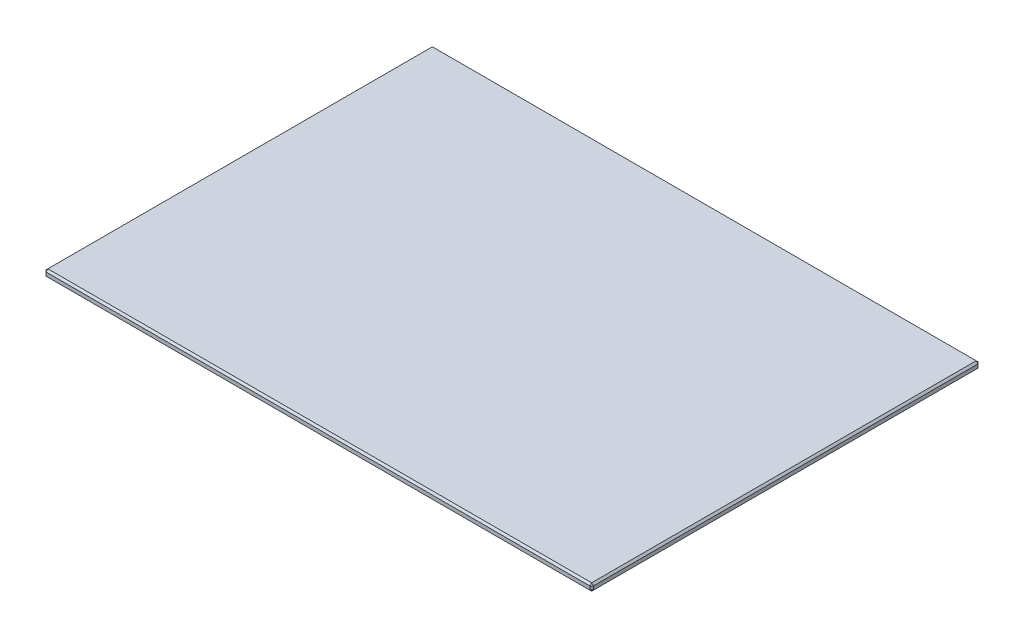
ISO-10303-21;
HEADER;
FILE_DESCRIPTION(('STEP AP214'),'2;1');
FILE_NAME('part.step','',(''),(''),'','','');
FILE_SCHEMA(('AUTOMOTIVE_DESIGN { 1 0 10303 214 1 1 1 1 }'));
ENDSEC;
DATA;
#1=APPLICATION_CONTEXT('core data for automotive mechanical design processes');
#2=APPLICATION_PROTOCOL_DEFINITION('international standard','automotive_design',2000,#1);
#3=PRODUCT_CONTEXT('',#1,'mechanical');
#4=PRODUCT('Part','Part','',(#3));
#5=PRODUCT_RELATED_PRODUCT_CATEGORY('part','',(#4));
#6=PRODUCT_DEFINITION_FORMATION('','',#4);
#7=PRODUCT_DEFINITION_CONTEXT('part definition',#1,'design');
#8=PRODUCT_DEFINITION('design','',#6,#7);
#9=PRODUCT_DEFINITION_SHAPE('','',#8);
#10=(LENGTH_UNIT() NAMED_UNIT(*) SI_UNIT(.MILLI.,.METRE.));
#11=(NAMED_UNIT(*) PLANE_ANGLE_UNIT() SI_UNIT($,.RADIAN.));
#12=(NAMED_UNIT(*) SI_UNIT($,.STERADIAN.) SOLID_ANGLE_UNIT());
#13=UNCERTAINTY_MEASURE_WITH_UNIT(LENGTH_MEASURE(1.E-05),#10,'distance_accuracy_value','');
#14=(GEOMETRIC_REPRESENTATION_CONTEXT(3) GLOBAL_UNCERTAINTY_ASSIGNED_CONTEXT((#13)) GLOBAL_UNIT_ASSIGNED_CONTEXT((#10,
#11,#12)) REPRESENTATION_CONTEXT('',''));
#15=CARTESIAN_POINT('',(0.,0.,0.));
#16=DIRECTION('',(0.,0.,1.));
#17=DIRECTION('',(1.,0.,0.));
#18=AXIS2_PLACEMENT_3D('',#15,#16,#17);
#19=CARTESIAN_POINT('',(-149.5,4.,106.));
#20=DIRECTION('',(1.,0.,0.));
#21=DIRECTION('',(0.,0.,-1.));
#22=AXIS2_PLACEMENT_3D('',#19,#20,#21);
#23=PLANE('',#22);
#24=DIRECTION('',(0.,-1.,0.));
#25=VECTOR('',#24,1.);
#26=CARTESIAN_POINT('',(-149.5,4.,-105.));
#27=LINE('',#26,#25);
#28=CARTESIAN_POINT('',(-149.5,3.,-105.));
#29=VERTEX_POINT('',#28);
#30=CARTESIAN_POINT('',(-149.5,1.,-105.));
#31=VERTEX_POINT('',#30);
#32=EDGE_CURVE('E194',#29,#31,#27,.T.);
#33=ORIENTED_EDGE('',*,*,#32,.T.);
#34=DIRECTION('',(0.,0.,1.));
#35=VECTOR('',#34,1.);
#36=CARTESIAN_POINT('',(-149.5,1.,106.));
#37=LINE('',#36,#35);
#38=CARTESIAN_POINT('',(-149.5,1.,105.));
#39=VERTEX_POINT('',#38);
#40=EDGE_CURVE('E196',#31,#39,#37,.T.);
#41=ORIENTED_EDGE('',*,*,#40,.T.);
#42=DIRECTION('',(0.,1.,0.));
#43=VECTOR('',#42,1.);
#44=CARTESIAN_POINT('',(-149.5,4.,105.));
#45=LINE('',#44,#43);
#46=CARTESIAN_POINT('',(-149.5,3.,105.));
#47=VERTEX_POINT('',#46);
#48=EDGE_CURVE('E190',#39,#47,#45,.T.);
#49=ORIENTED_EDGE('',*,*,#48,.T.);
#50=DIRECTION('',(0.,0.,-1.));
#51=VECTOR('',#50,1.);
#52=CARTESIAN_POINT('',(-149.5,3.,106.));
#53=LINE('',#52,#51);
#54=EDGE_CURVE('E192',#47,#29,#53,.T.);
#55=ORIENTED_EDGE('',*,*,#54,.T.);
#56=EDGE_LOOP('',(#33,#41,#49,#55));
#57=FACE_BOUND('',#56,.T.);
#58=ADVANCED_FACE('F35',(#57),#23,.F.);
#59=CARTESIAN_POINT('',(-149.5,4.,106.));
#60=DIRECTION('',(0.,0.,-1.));
#61=DIRECTION('',(-1.,0.,0.));
#62=AXIS2_PLACEMENT_3D('',#59,#60,#61);
#63=PLANE('',#62);
#64=DIRECTION('',(0.,-1.,0.));
#65=VECTOR('',#64,1.);
#66=CARTESIAN_POINT('',(-148.5,4.,106.));
#67=LINE('',#66,#65);
#68=CARTESIAN_POINT('',(-148.5,3.,106.));
#69=VERTEX_POINT('',#68);
#70=CARTESIAN_POINT('',(-148.5,1.,106.));
#71=VERTEX_POINT('',#70);
#72=EDGE_CURVE('E127',#69,#71,#67,.T.);
#73=ORIENTED_EDGE('',*,*,#72,.T.);
#74=DIRECTION('',(1.,0.,0.));
#75=VECTOR('',#74,1.);
#76=CARTESIAN_POINT('',(149.5,1.,106.));
#77=LINE('',#76,#75);
#78=CARTESIAN_POINT('',(148.5,1.,106.));
#79=VERTEX_POINT('',#78);
#80=EDGE_CURVE('E161',#71,#79,#77,.T.);
#81=ORIENTED_EDGE('',*,*,#80,.T.);
#82=DIRECTION('',(0.,1.,0.));
#83=VECTOR('',#82,1.);
#84=CARTESIAN_POINT('',(148.5,4.,106.));
#85=LINE('',#84,#83);
#86=CARTESIAN_POINT('',(148.5,3.,106.));
#87=VERTEX_POINT('',#86);
#88=EDGE_CURVE('E130',#79,#87,#85,.T.);
#89=ORIENTED_EDGE('',*,*,#88,.T.);
#90=DIRECTION('',(-1.,0.,0.));
#91=VECTOR('',#90,1.);
#92=CARTESIAN_POINT('',(-149.5,3.,106.));
#93=LINE('',#92,#91);
#94=EDGE_CURVE('E122',#87,#69,#93,.T.);
#95=ORIENTED_EDGE('',*,*,#94,.T.);
#96=EDGE_LOOP('',(#73,#81,#89,#95));
#97=FACE_BOUND('',#96,.T.);
#98=ADVANCED_FACE('F124',(#97),#63,.F.);
#99=CARTESIAN_POINT('',(149.5,4.,106.));
#100=DIRECTION('',(-1.,0.,0.));
#101=DIRECTION('',(0.,0.,1.));
#102=AXIS2_PLACEMENT_3D('',#99,#100,#101);
#103=PLANE('',#102);
#104=DIRECTION('',(0.,-1.,0.));
#105=VECTOR('',#104,1.);
#106=CARTESIAN_POINT('',(149.5,4.,105.));
#107=LINE('',#106,#105);
#108=CARTESIAN_POINT('',(149.5,3.,105.));
#109=VERTEX_POINT('',#108);
#110=CARTESIAN_POINT('',(149.5,1.,105.));
#111=VERTEX_POINT('',#110);
#112=EDGE_CURVE('E172',#109,#111,#107,.T.);
#113=ORIENTED_EDGE('',*,*,#112,.T.);
#114=DIRECTION('',(0.,0.,-1.));
#115=VECTOR('',#114,1.);
#116=CARTESIAN_POINT('',(149.5,1.,-106.));
#117=LINE('',#116,#115);
#118=CARTESIAN_POINT('',(149.5,1.,-105.));
#119=VERTEX_POINT('',#118);
#120=EDGE_CURVE('E178',#111,#119,#117,.T.);
#121=ORIENTED_EDGE('',*,*,#120,.T.);
#122=DIRECTION('',(0.,1.,0.));
#123=VECTOR('',#122,1.);
#124=CARTESIAN_POINT('',(149.5,4.,-105.));
#125=LINE('',#124,#123);
#126=CARTESIAN_POINT('',(149.5,3.,-105.));
#127=VERTEX_POINT('',#126);
#128=EDGE_CURVE('E176',#119,#127,#125,.T.);
#129=ORIENTED_EDGE('',*,*,#128,.T.);
#130=DIRECTION('',(0.,0.,1.));
#131=VECTOR('',#130,1.);
#132=CARTESIAN_POINT('',(149.5,3.,106.));
#133=LINE('',#132,#131);
#134=EDGE_CURVE('E174',#127,#109,#133,.T.);
#135=ORIENTED_EDGE('',*,*,#134,.T.);
#136=EDGE_LOOP('',(#113,#121,#129,#135));
#137=FACE_BOUND('',#136,.T.);
#138=ADVANCED_FACE('F265',(#137),#103,.F.);
#139=CARTESIAN_POINT('',(-149.5,4.,-106.));
#140=DIRECTION('',(0.,0.,1.));
#141=DIRECTION('',(1.,0.,0.));
#142=AXIS2_PLACEMENT_3D('',#139,#140,#141);
#143=PLANE('',#142);
#144=DIRECTION('',(1.,0.,0.));
#145=VECTOR('',#144,1.);
#146=CARTESIAN_POINT('',(-149.5,3.,-106.));
#147=LINE('',#146,#145);
#148=CARTESIAN_POINT('',(-148.5,3.,-106.));
#149=VERTEX_POINT('',#148);
#150=CARTESIAN_POINT('',(148.5,3.,-106.));
#151=VERTEX_POINT('',#150);
#152=EDGE_CURVE('E183',#149,#151,#147,.T.);
#153=ORIENTED_EDGE('',*,*,#152,.T.);
#154=DIRECTION('',(0.,-1.,0.));
#155=VECTOR('',#154,1.);
#156=CARTESIAN_POINT('',(148.5,4.,-106.));
#157=LINE('',#156,#155);
#158=CARTESIAN_POINT('',(148.5,1.,-106.));
#159=VERTEX_POINT('',#158);
#160=EDGE_CURVE('E188',#151,#159,#157,.T.);
#161=ORIENTED_EDGE('',*,*,#160,.T.);
#162=DIRECTION('',(-1.,0.,0.));
#163=VECTOR('',#162,1.);
#164=CARTESIAN_POINT('',(-149.5,1.,-106.));
#165=LINE('',#164,#163);
#166=CARTESIAN_POINT('',(-148.5,1.,-106.));
#167=VERTEX_POINT('',#166);
#168=EDGE_CURVE('E185',#159,#167,#165,.T.);
#169=ORIENTED_EDGE('',*,*,#168,.T.);
#170=DIRECTION('',(0.,1.,0.));
#171=VECTOR('',#170,1.);
#172=CARTESIAN_POINT('',(-148.5,4.,-106.));
#173=LINE('',#172,#171);
#174=EDGE_CURVE('E181',#167,#149,#173,.T.);
#175=ORIENTED_EDGE('',*,*,#174,.T.);
#176=EDGE_LOOP('',(#153,#161,#169,#175));
#177=FACE_BOUND('',#176,.T.);
#178=ADVANCED_FACE('F274',(#177),#143,.F.);
#179=CARTESIAN_POINT('',(0.,4.,0.));
#180=DIRECTION('',(0.,-1.,0.));
#181=DIRECTION('',(0.,0.,-1.));
#182=AXIS2_PLACEMENT_3D('',#179,#180,#181);
#183=PLANE('',#182);
#184=DIRECTION('',(0.,0.,-1.));
#185=VECTOR('',#184,1.);
#186=CARTESIAN_POINT('',(148.5,4.,0.));
#187=LINE('',#186,#185);
#188=CARTESIAN_POINT('',(148.5,4.,105.));
#189=VERTEX_POINT('',#188);
#190=CARTESIAN_POINT('',(148.5,4.,-105.));
#191=VERTEX_POINT('',#190);
#192=EDGE_CURVE('E44',#189,#191,#187,.T.);
#193=ORIENTED_EDGE('',*,*,#192,.T.);
#194=DIRECTION('',(-1.,0.,0.));
#195=VECTOR('',#194,1.);
#196=CARTESIAN_POINT('',(0.,4.,-105.));
#197=LINE('',#196,#195);
#198=CARTESIAN_POINT('',(-148.5,4.,-105.));
#199=VERTEX_POINT('',#198);
#200=EDGE_CURVE('E11',#191,#199,#197,.T.);
#201=ORIENTED_EDGE('',*,*,#200,.T.);
#202=DIRECTION('',(0.,0.,1.));
#203=VECTOR('',#202,1.);
#204=CARTESIAN_POINT('',(-148.5,4.,0.));
#205=LINE('',#204,#203);
#206=CARTESIAN_POINT('',(-148.5,4.,105.));
#207=VERTEX_POINT('',#206);
#208=EDGE_CURVE('E199',#199,#207,#205,.T.);
#209=ORIENTED_EDGE('',*,*,#208,.T.);
#210=DIRECTION('',(1.,0.,0.));
#211=VECTOR('',#210,1.);
#212=CARTESIAN_POINT('',(0.,4.,105.));
#213=LINE('',#212,#211);
#214=EDGE_CURVE('E55',#207,#189,#213,.T.);
#215=ORIENTED_EDGE('',*,*,#214,.T.);
#216=EDGE_LOOP('',(#193,#201,#209,#215));
#217=FACE_BOUND('',#216,.T.);
#218=ADVANCED_FACE('F296',(#217),#183,.F.);
#219=CARTESIAN_POINT('',(0.,0.,0.));
#220=DIRECTION('',(0.,-1.,0.));
#221=DIRECTION('',(0.,0.,-1.));
#222=AXIS2_PLACEMENT_3D('',#219,#220,#221);
#223=PLANE('',#222);
#224=DIRECTION('',(0.,0.,1.));
#225=VECTOR('',#224,1.);
#226=CARTESIAN_POINT('',(148.5,0.,106.));
#227=LINE('',#226,#225);
#228=CARTESIAN_POINT('',(148.5,0.,-105.));
#229=VERTEX_POINT('',#228);
#230=CARTESIAN_POINT('',(148.5,0.,105.));
#231=VERTEX_POINT('',#230);
#232=EDGE_CURVE('E167',#229,#231,#227,.T.);
#233=ORIENTED_EDGE('',*,*,#232,.T.);
#234=DIRECTION('',(-1.,0.,0.));
#235=VECTOR('',#234,1.);
#236=CARTESIAN_POINT('',(-149.5,0.,105.));
#237=LINE('',#236,#235);
#238=CARTESIAN_POINT('',(-148.5,0.,105.));
#239=VERTEX_POINT('',#238);
#240=EDGE_CURVE('E169',#231,#239,#237,.T.);
#241=ORIENTED_EDGE('',*,*,#240,.T.);
#242=DIRECTION('',(0.,0.,-1.));
#243=VECTOR('',#242,1.);
#244=CARTESIAN_POINT('',(-148.5,0.,-106.));
#245=LINE('',#244,#243);
#246=CARTESIAN_POINT('',(-148.5,0.,-105.));
#247=VERTEX_POINT('',#246);
#248=EDGE_CURVE('E163',#239,#247,#245,.T.);
#249=ORIENTED_EDGE('',*,*,#248,.T.);
#250=DIRECTION('',(1.,0.,0.));
#251=VECTOR('',#250,1.);
#252=CARTESIAN_POINT('',(149.5,0.,-105.));
#253=LINE('',#252,#251);
#254=EDGE_CURVE('E165',#247,#229,#253,.T.);
#255=ORIENTED_EDGE('',*,*,#254,.T.);
#256=EDGE_LOOP('',(#233,#241,#249,#255));
#257=FACE_BOUND('',#256,.T.);
#258=ADVANCED_FACE('F298',(#257),#223,.T.);
#259=CARTESIAN_POINT('',(0.,4.,-105.));
#260=DIRECTION('',(0.,-0.707106781186547,0.707106781186547));
#261=DIRECTION('',(-1.,0.,0.));
#262=AXIS2_PLACEMENT_3D('',#259,#260,#261);
#263=PLANE('',#262);
#264=DIRECTION('',(0.,0.707106781186547,0.707106781186547));
#265=VECTOR('',#264,1.);
#266=CARTESIAN_POINT('',(-148.5,4.,-105.));
#267=LINE('',#266,#265);
#268=EDGE_CURVE('E39',#199,#149,#267,.F.);
#269=ORIENTED_EDGE('',*,*,#268,.F.);
#270=ORIENTED_EDGE('',*,*,#200,.F.);
#271=DIRECTION('',(0.,-0.707106781186547,-0.707106781186547));
#272=VECTOR('',#271,1.);
#273=CARTESIAN_POINT('',(148.5,3.,-106.));
#274=LINE('',#273,#272);
#275=EDGE_CURVE('E158',#151,#191,#274,.F.);
#276=ORIENTED_EDGE('',*,*,#275,.F.);
#277=ORIENTED_EDGE('',*,*,#152,.F.);
#278=EDGE_LOOP('',(#269,#270,#276,#277));
#279=FACE_BOUND('',#278,.T.);
#280=ADVANCED_FACE('F37',(#279),#263,.F.);
#281=CARTESIAN_POINT('',(-148.5,4.,-105.));
#282=DIRECTION('',(-0.577350269189626,0.577350269189626,-0.577350269189626));
#283=DIRECTION('',(-0.707106781186547,0.,0.707106781186547));
#284=AXIS2_PLACEMENT_3D('',#281,#282,#283);
#285=PLANE('',#284);
#286=DIRECTION('',(-0.707106781186547,-0.707106781186547,0.));
#287=VECTOR('',#286,1.);
#288=CARTESIAN_POINT('',(-148.5,4.,-105.));
#289=LINE('',#288,#287);
#290=EDGE_CURVE('E245',#199,#29,#289,.T.);
#291=ORIENTED_EDGE('',*,*,#290,.F.);
#292=ORIENTED_EDGE('',*,*,#268,.T.);
#293=DIRECTION('',(0.707106781186547,0.,-0.707106781186547));
#294=VECTOR('',#293,1.);
#295=CARTESIAN_POINT('',(-149.,3.,-105.5));
#296=LINE('',#295,#294);
#297=EDGE_CURVE('E248',#29,#149,#296,.T.);
#298=ORIENTED_EDGE('',*,*,#297,.F.);
#299=EDGE_LOOP('',(#291,#292,#298));
#300=FACE_BOUND('',#299,.T.);
#301=ADVANCED_FACE('F292',(#300),#285,.T.);
#302=CARTESIAN_POINT('',(148.5,3.,-106.));
#303=DIRECTION('',(0.577350269189626,0.577350269189626,-0.577350269189626));
#304=DIRECTION('',(-0.707106781186547,0.,-0.707106781186547));
#305=AXIS2_PLACEMENT_3D('',#302,#303,#304);
#306=PLANE('',#305);
#307=DIRECTION('',(0.707106781186547,0.,0.707106781186547));
#308=VECTOR('',#307,1.);
#309=CARTESIAN_POINT('',(148.5,3.,-106.));
#310=LINE('',#309,#308);
#311=EDGE_CURVE('E239',#151,#127,#310,.T.);
#312=ORIENTED_EDGE('',*,*,#311,.F.);
#313=ORIENTED_EDGE('',*,*,#275,.T.);
#314=DIRECTION('',(-0.707106781186547,0.707106781186547,0.));
#315=VECTOR('',#314,1.);
#316=CARTESIAN_POINT('',(149.,3.5,-105.));
#317=LINE('',#316,#315);
#318=EDGE_CURVE('E242',#127,#191,#317,.T.);
#319=ORIENTED_EDGE('',*,*,#318,.F.);
#320=EDGE_LOOP('',(#312,#313,#319));
#321=FACE_BOUND('',#320,.T.);
#322=ADVANCED_FACE('F255',(#321),#306,.T.);
#323=CARTESIAN_POINT('',(-149.5,4.,-105.));
#324=DIRECTION('',(0.707106781186547,0.,0.707106781186547));
#325=DIRECTION('',(0.,-1.,0.));
#326=AXIS2_PLACEMENT_3D('',#323,#324,#325);
#327=PLANE('',#326);
#328=ORIENTED_EDGE('',*,*,#297,.T.);
#329=ORIENTED_EDGE('',*,*,#174,.F.);
#330=DIRECTION('',(-0.707106781186547,0.,0.707106781186547));
#331=VECTOR('',#330,1.);
#332=CARTESIAN_POINT('',(-148.5,1.,-106.));
#333=LINE('',#332,#331);
#334=EDGE_CURVE('E234',#31,#167,#333,.F.);
#335=ORIENTED_EDGE('',*,*,#334,.F.);
#336=ORIENTED_EDGE('',*,*,#32,.F.);
#337=EDGE_LOOP('',(#328,#329,#335,#336));
#338=FACE_BOUND('',#337,.T.);
#339=ADVANCED_FACE('F286',(#338),#327,.F.);
#340=CARTESIAN_POINT('',(-148.5,4.,0.));
#341=DIRECTION('',(0.707106781186547,-0.707106781186547,0.));
#342=DIRECTION('',(0.,0.,1.));
#343=AXIS2_PLACEMENT_3D('',#340,#341,#342);
#344=PLANE('',#343);
#345=ORIENTED_EDGE('',*,*,#290,.T.);
#346=ORIENTED_EDGE('',*,*,#54,.F.);
#347=DIRECTION('',(0.707106781186547,0.707106781186547,0.));
#348=VECTOR('',#347,1.);
#349=CARTESIAN_POINT('',(-149.,3.5,105.));
#350=LINE('',#349,#348);
#351=EDGE_CURVE('E142',#207,#47,#350,.F.);
#352=ORIENTED_EDGE('',*,*,#351,.F.);
#353=ORIENTED_EDGE('',*,*,#208,.F.);
#354=EDGE_LOOP('',(#345,#346,#352,#353));
#355=FACE_BOUND('',#354,.T.);
#356=ADVANCED_FACE('F295',(#355),#344,.F.);
#357=CARTESIAN_POINT('',(0.,4.,105.));
#358=DIRECTION('',(0.,-0.707106781186547,-0.707106781186547));
#359=DIRECTION('',(1.,0.,0.));
#360=AXIS2_PLACEMENT_3D('',#357,#358,#359);
#361=PLANE('',#360);
#362=DIRECTION('',(0.,0.707106781186547,-0.707106781186547));
#363=VECTOR('',#362,1.);
#364=CARTESIAN_POINT('',(148.5,3.5,105.5));
#365=LINE('',#364,#363);
#366=EDGE_CURVE('E143',#189,#87,#365,.F.);
#367=ORIENTED_EDGE('',*,*,#366,.F.);
#368=ORIENTED_EDGE('',*,*,#214,.F.);
#369=DIRECTION('',(0.,-0.707106781186547,0.707106781186547));
#370=VECTOR('',#369,1.);
#371=CARTESIAN_POINT('',(-148.5,3.,106.));
#372=LINE('',#371,#370);
#373=EDGE_CURVE('E136',#69,#207,#372,.F.);
#374=ORIENTED_EDGE('',*,*,#373,.F.);
#375=ORIENTED_EDGE('',*,*,#94,.F.);
#376=EDGE_LOOP('',(#367,#368,#374,#375));
#377=FACE_BOUND('',#376,.T.);
#378=ADVANCED_FACE('F138',(#377),#361,.F.);
#379=CARTESIAN_POINT('',(148.5,4.,0.));
#380=DIRECTION('',(-0.707106781186547,-0.707106781186547,0.));
#381=DIRECTION('',(0.,0.,-1.));
#382=AXIS2_PLACEMENT_3D('',#379,#380,#381);
#383=PLANE('',#382);
#384=ORIENTED_EDGE('',*,*,#318,.T.);
#385=ORIENTED_EDGE('',*,*,#192,.F.);
#386=DIRECTION('',(0.707106781186547,-0.707106781186547,0.));
#387=VECTOR('',#386,1.);
#388=CARTESIAN_POINT('',(149.5,3.,105.));
#389=LINE('',#388,#387);
#390=EDGE_CURVE('E229',#109,#189,#389,.F.);
#391=ORIENTED_EDGE('',*,*,#390,.F.);
#392=ORIENTED_EDGE('',*,*,#134,.F.);
#393=EDGE_LOOP('',(#384,#385,#391,#392));
#394=FACE_BOUND('',#393,.T.);
#395=ADVANCED_FACE('F261',(#394),#383,.F.);
#396=CARTESIAN_POINT('',(148.5,4.,-106.));
#397=DIRECTION('',(-0.707106781186547,0.,0.707106781186547));
#398=DIRECTION('',(0.,-1.,0.));
#399=AXIS2_PLACEMENT_3D('',#396,#397,#398);
#400=PLANE('',#399);
#401=ORIENTED_EDGE('',*,*,#311,.T.);
#402=ORIENTED_EDGE('',*,*,#128,.F.);
#403=DIRECTION('',(-0.707106781186547,0.,-0.707106781186547));
#404=VECTOR('',#403,1.);
#405=CARTESIAN_POINT('',(149.5,1.,-105.));
#406=LINE('',#405,#404);
#407=EDGE_CURVE('E226',#159,#119,#406,.F.);
#408=ORIENTED_EDGE('',*,*,#407,.F.);
#409=ORIENTED_EDGE('',*,*,#160,.F.);
#410=EDGE_LOOP('',(#401,#402,#408,#409));
#411=FACE_BOUND('',#410,.T.);
#412=ADVANCED_FACE('F271',(#411),#400,.F.);
#413=CARTESIAN_POINT('',(-149.5,1.,-106.));
#414=DIRECTION('',(0.,-0.707106781186547,-0.707106781186547));
#415=DIRECTION('',(1.,0.,0.));
#416=AXIS2_PLACEMENT_3D('',#413,#414,#415);
#417=PLANE('',#416);
#418=DIRECTION('',(0.,-0.707106781186547,0.707106781186547));
#419=VECTOR('',#418,1.);
#420=CARTESIAN_POINT('',(-148.5,1.,-106.));
#421=LINE('',#420,#419);
#422=EDGE_CURVE('E236',#167,#247,#421,.T.);
#423=ORIENTED_EDGE('',*,*,#422,.F.);
#424=ORIENTED_EDGE('',*,*,#168,.F.);
#425=DIRECTION('',(0.,0.707106781186547,-0.707106781186547));
#426=VECTOR('',#425,1.);
#427=CARTESIAN_POINT('',(148.5,0.5,-105.5));
#428=LINE('',#427,#426);
#429=EDGE_CURVE('E223',#229,#159,#428,.T.);
#430=ORIENTED_EDGE('',*,*,#429,.F.);
#431=ORIENTED_EDGE('',*,*,#254,.F.);
#432=EDGE_LOOP('',(#423,#424,#430,#431));
#433=FACE_BOUND('',#432,.T.);
#434=ADVANCED_FACE('F278',(#433),#417,.T.);
#435=CARTESIAN_POINT('',(-148.5,1.,-106.));
#436=DIRECTION('',(-0.577350269189626,-0.577350269189626,-0.577350269189626));
#437=DIRECTION('',(-0.707106781186547,0.,0.707106781186547));
#438=AXIS2_PLACEMENT_3D('',#435,#436,#437);
#439=PLANE('',#438);
#440=ORIENTED_EDGE('',*,*,#334,.T.);
#441=ORIENTED_EDGE('',*,*,#422,.T.);
#442=DIRECTION('',(-0.707106781186547,0.707106781186547,0.));
#443=VECTOR('',#442,1.);
#444=CARTESIAN_POINT('',(-149.,0.5,-105.));
#445=LINE('',#444,#443);
#446=EDGE_CURVE('E150',#31,#247,#445,.F.);
#447=ORIENTED_EDGE('',*,*,#446,.F.);
#448=EDGE_LOOP('',(#440,#441,#447));
#449=FACE_BOUND('',#448,.T.);
#450=ADVANCED_FACE('F352',(#449),#439,.T.);
#451=CARTESIAN_POINT('',(-148.5,3.,106.));
#452=DIRECTION('',(-0.577350269189626,0.577350269189626,0.577350269189626));
#453=DIRECTION('',(0.707106781186547,0.,0.707106781186547));
#454=AXIS2_PLACEMENT_3D('',#451,#452,#453);
#455=PLANE('',#454);
#456=ORIENTED_EDGE('',*,*,#373,.T.);
#457=ORIENTED_EDGE('',*,*,#351,.T.);
#458=DIRECTION('',(-0.707106781186547,0.,-0.707106781186547));
#459=VECTOR('',#458,1.);
#460=CARTESIAN_POINT('',(-148.5,3.,106.));
#461=LINE('',#460,#459);
#462=EDGE_CURVE('E146',#69,#47,#461,.T.);
#463=ORIENTED_EDGE('',*,*,#462,.F.);
#464=EDGE_LOOP('',(#456,#457,#463));
#465=FACE_BOUND('',#464,.T.);
#466=ADVANCED_FACE('F147',(#465),#455,.T.);
#467=CARTESIAN_POINT('',(149.5,3.,105.));
#468=DIRECTION('',(0.577350269189626,0.577350269189626,0.577350269189626));
#469=DIRECTION('',(0.707106781186547,0.,-0.707106781186547));
#470=AXIS2_PLACEMENT_3D('',#467,#468,#469);
#471=PLANE('',#470);
#472=ORIENTED_EDGE('',*,*,#390,.T.);
#473=ORIENTED_EDGE('',*,*,#366,.T.);
#474=DIRECTION('',(-0.707106781186547,0.,0.707106781186547));
#475=VECTOR('',#474,1.);
#476=CARTESIAN_POINT('',(149.5,3.,105.));
#477=LINE('',#476,#475);
#478=EDGE_CURVE('E151',#109,#87,#477,.T.);
#479=ORIENTED_EDGE('',*,*,#478,.F.);
#480=EDGE_LOOP('',(#472,#473,#479));
#481=FACE_BOUND('',#480,.T.);
#482=ADVANCED_FACE('F345',(#481),#471,.T.);
#483=CARTESIAN_POINT('',(149.5,1.,-105.));
#484=DIRECTION('',(0.577350269189626,-0.577350269189626,-0.577350269189626));
#485=DIRECTION('',(-0.707106781186547,0.,-0.707106781186547));
#486=AXIS2_PLACEMENT_3D('',#483,#484,#485);
#487=PLANE('',#486);
#488=ORIENTED_EDGE('',*,*,#429,.T.);
#489=ORIENTED_EDGE('',*,*,#407,.T.);
#490=DIRECTION('',(-0.707106781186547,-0.707106781186547,0.));
#491=VECTOR('',#490,1.);
#492=CARTESIAN_POINT('',(149.5,1.,-105.));
#493=LINE('',#492,#491);
#494=EDGE_CURVE('E217',#229,#119,#493,.F.);
#495=ORIENTED_EDGE('',*,*,#494,.F.);
#496=EDGE_LOOP('',(#488,#489,#495));
#497=FACE_BOUND('',#496,.T.);
#498=ADVANCED_FACE('F341',(#497),#487,.T.);
#499=CARTESIAN_POINT('',(-149.5,1.,106.));
#500=DIRECTION('',(-0.707106781186547,-0.707106781186547,0.));
#501=DIRECTION('',(0.,0.,-1.));
#502=AXIS2_PLACEMENT_3D('',#499,#500,#501);
#503=PLANE('',#502);
#504=ORIENTED_EDGE('',*,*,#446,.T.);
#505=ORIENTED_EDGE('',*,*,#248,.F.);
#506=DIRECTION('',(0.707106781186547,-0.707106781186547,0.));
#507=VECTOR('',#506,1.);
#508=CARTESIAN_POINT('',(-148.5,0.,105.));
#509=LINE('',#508,#507);
#510=EDGE_CURVE('E214',#39,#239,#509,.T.);
#511=ORIENTED_EDGE('',*,*,#510,.F.);
#512=ORIENTED_EDGE('',*,*,#40,.F.);
#513=EDGE_LOOP('',(#504,#505,#511,#512));
#514=FACE_BOUND('',#513,.T.);
#515=ADVANCED_FACE('F338',(#514),#503,.T.);
#516=CARTESIAN_POINT('',(-148.5,4.,106.));
#517=DIRECTION('',(0.707106781186547,0.,-0.707106781186547));
#518=DIRECTION('',(0.,-1.,0.));
#519=AXIS2_PLACEMENT_3D('',#516,#517,#518);
#520=PLANE('',#519);
#521=ORIENTED_EDGE('',*,*,#462,.T.);
#522=ORIENTED_EDGE('',*,*,#48,.F.);
#523=DIRECTION('',(0.707106781186547,0.,0.707106781186547));
#524=VECTOR('',#523,1.);
#525=CARTESIAN_POINT('',(-149.,1.,105.5));
#526=LINE('',#525,#524);
#527=EDGE_CURVE('E154',#71,#39,#526,.F.);
#528=ORIENTED_EDGE('',*,*,#527,.F.);
#529=ORIENTED_EDGE('',*,*,#72,.F.);
#530=EDGE_LOOP('',(#521,#522,#528,#529));
#531=FACE_BOUND('',#530,.T.);
#532=ADVANCED_FACE('F153',(#531),#520,.F.);
#533=CARTESIAN_POINT('',(149.5,4.,105.));
#534=DIRECTION('',(-0.707106781186547,0.,-0.707106781186547));
#535=DIRECTION('',(0.,-1.,0.));
#536=AXIS2_PLACEMENT_3D('',#533,#534,#535);
#537=PLANE('',#536);
#538=ORIENTED_EDGE('',*,*,#478,.T.);
#539=ORIENTED_EDGE('',*,*,#88,.F.);
#540=DIRECTION('',(0.707106781186547,0.,-0.707106781186547));
#541=VECTOR('',#540,1.);
#542=CARTESIAN_POINT('',(148.5,1.,106.));
#543=LINE('',#542,#541);
#544=EDGE_CURVE('E210',#111,#79,#543,.F.);
#545=ORIENTED_EDGE('',*,*,#544,.F.);
#546=ORIENTED_EDGE('',*,*,#112,.F.);
#547=EDGE_LOOP('',(#538,#539,#545,#546));
#548=FACE_BOUND('',#547,.T.);
#549=ADVANCED_FACE('F331',(#548),#537,.F.);
#550=CARTESIAN_POINT('',(149.5,1.,106.));
#551=DIRECTION('',(0.707106781186547,-0.707106781186547,0.));
#552=DIRECTION('',(0.,0.,1.));
#553=AXIS2_PLACEMENT_3D('',#550,#551,#552);
#554=PLANE('',#553);
#555=ORIENTED_EDGE('',*,*,#494,.T.);
#556=ORIENTED_EDGE('',*,*,#120,.F.);
#557=DIRECTION('',(0.707106781186547,0.707106781186547,0.));
#558=VECTOR('',#557,1.);
#559=CARTESIAN_POINT('',(149.,0.5,105.));
#560=LINE('',#559,#558);
#561=EDGE_CURVE('E207',#231,#111,#560,.T.);
#562=ORIENTED_EDGE('',*,*,#561,.F.);
#563=ORIENTED_EDGE('',*,*,#232,.F.);
#564=EDGE_LOOP('',(#555,#556,#562,#563));
#565=FACE_BOUND('',#564,.T.);
#566=ADVANCED_FACE('F327',(#565),#554,.T.);
#567=CARTESIAN_POINT('',(-148.5,0.,105.));
#568=DIRECTION('',(-0.577350269189626,-0.577350269189626,0.577350269189626));
#569=DIRECTION('',(0.707106781186547,0.,0.707106781186547));
#570=AXIS2_PLACEMENT_3D('',#567,#568,#569);
#571=PLANE('',#570);
#572=ORIENTED_EDGE('',*,*,#527,.T.);
#573=ORIENTED_EDGE('',*,*,#510,.T.);
#574=DIRECTION('',(0.,0.707106781186547,0.707106781186547));
#575=VECTOR('',#574,1.);
#576=CARTESIAN_POINT('',(-148.5,0.,105.));
#577=LINE('',#576,#575);
#578=EDGE_CURVE('E205',#71,#239,#577,.F.);
#579=ORIENTED_EDGE('',*,*,#578,.F.);
#580=EDGE_LOOP('',(#572,#573,#579));
#581=FACE_BOUND('',#580,.T.);
#582=ADVANCED_FACE('F323',(#581),#571,.T.);
#583=CARTESIAN_POINT('',(148.5,1.,106.));
#584=DIRECTION('',(0.577350269189626,-0.577350269189626,0.577350269189626));
#585=DIRECTION('',(0.707106781186547,0.,-0.707106781186547));
#586=AXIS2_PLACEMENT_3D('',#583,#584,#585);
#587=PLANE('',#586);
#588=ORIENTED_EDGE('',*,*,#561,.T.);
#589=ORIENTED_EDGE('',*,*,#544,.T.);
#590=DIRECTION('',(0.,-0.707106781186547,-0.707106781186547));
#591=VECTOR('',#590,1.);
#592=CARTESIAN_POINT('',(148.5,1.,106.));
#593=LINE('',#592,#591);
#594=EDGE_CURVE('E203',#231,#79,#593,.F.);
#595=ORIENTED_EDGE('',*,*,#594,.F.);
#596=EDGE_LOOP('',(#588,#589,#595));
#597=FACE_BOUND('',#596,.T.);
#598=ADVANCED_FACE('F319',(#597),#587,.T.);
#599=CARTESIAN_POINT('',(-149.5,1.,106.));
#600=DIRECTION('',(0.,-0.707106781186547,0.707106781186547));
#601=DIRECTION('',(-1.,0.,0.));
#602=AXIS2_PLACEMENT_3D('',#599,#600,#601);
#603=PLANE('',#602);
#604=ORIENTED_EDGE('',*,*,#578,.T.);
#605=ORIENTED_EDGE('',*,*,#240,.F.);
#606=ORIENTED_EDGE('',*,*,#594,.T.);
#607=ORIENTED_EDGE('',*,*,#80,.F.);
#608=EDGE_LOOP('',(#604,#605,#606,#607));
#609=FACE_BOUND('',#608,.T.);
#610=ADVANCED_FACE('F316',(#609),#603,.T.);
#611=CLOSED_SHELL('',(#58,#98,#138,#178,#218,#258,#280,#301,#322,#339,#356,#378,#395,#412,#434,
#450,#466,#482,#498,#515,#532,#549,#566,#582,#598,#610));
#612=MANIFOLD_SOLID_BREP('B2',#611);
#613=ADVANCED_BREP_SHAPE_REPRESENTATION('',(#18,#612),#14);
#614=SHAPE_DEFINITION_REPRESENTATION(#9,#613);
ENDSEC;
END-ISO-10303-21;
